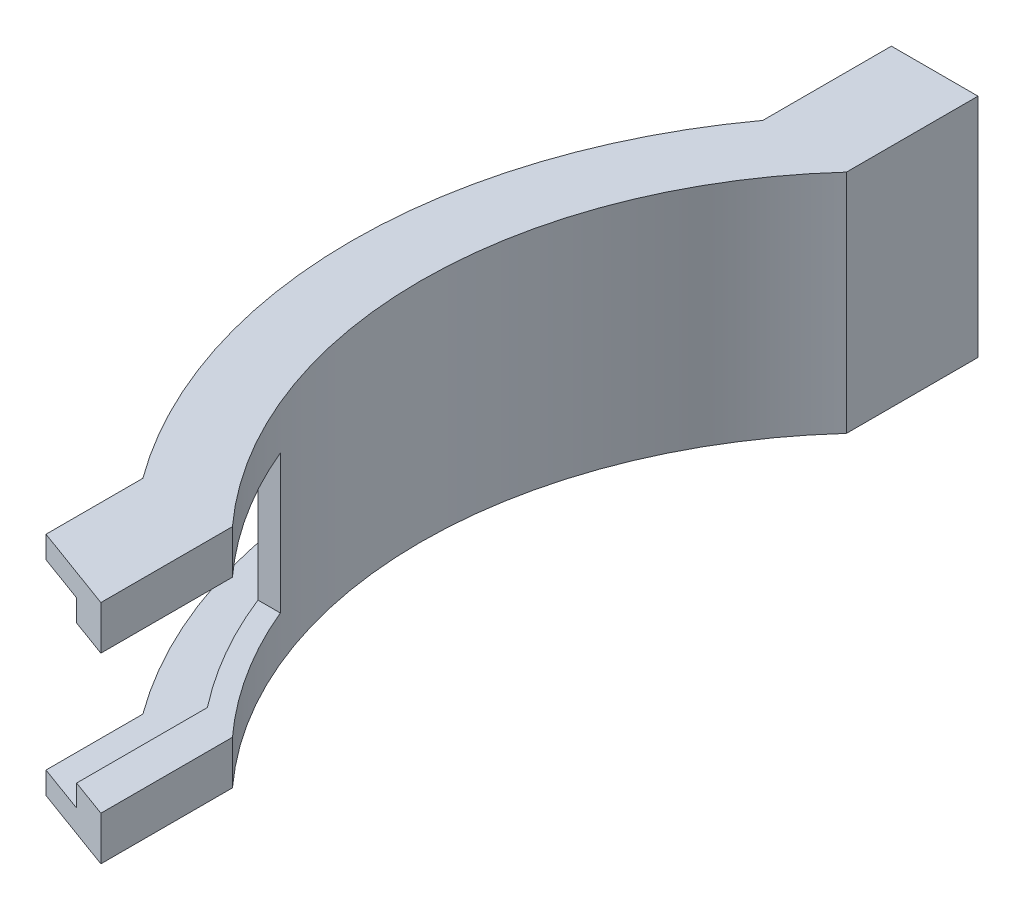
ISO-10303-21;
HEADER;
FILE_DESCRIPTION(('STEP AP214'),'2;1');
FILE_NAME('part.step','',(''),(''),'','','');
FILE_SCHEMA(('AUTOMOTIVE_DESIGN { 1 0 10303 214 1 1 1 1 }'));
ENDSEC;
DATA;
#1=APPLICATION_CONTEXT('core data for automotive mechanical design processes');
#2=APPLICATION_PROTOCOL_DEFINITION('international standard','automotive_design',2000,#1);
#3=PRODUCT_CONTEXT('',#1,'mechanical');
#4=PRODUCT('Part','Part','',(#3));
#5=PRODUCT_RELATED_PRODUCT_CATEGORY('part','',(#4));
#6=PRODUCT_DEFINITION_FORMATION('','',#4);
#7=PRODUCT_DEFINITION_CONTEXT('part definition',#1,'design');
#8=PRODUCT_DEFINITION('design','',#6,#7);
#9=PRODUCT_DEFINITION_SHAPE('','',#8);
#10=(LENGTH_UNIT() NAMED_UNIT(*) SI_UNIT(.MILLI.,.METRE.));
#11=(NAMED_UNIT(*) PLANE_ANGLE_UNIT() SI_UNIT($,.RADIAN.));
#12=(NAMED_UNIT(*) SI_UNIT($,.STERADIAN.) SOLID_ANGLE_UNIT());
#13=UNCERTAINTY_MEASURE_WITH_UNIT(LENGTH_MEASURE(1.E-05),#10,'distance_accuracy_value','');
#14=(GEOMETRIC_REPRESENTATION_CONTEXT(3) GLOBAL_UNCERTAINTY_ASSIGNED_CONTEXT((#13)) GLOBAL_UNIT_ASSIGNED_CONTEXT((#10,
#11,#12)) REPRESENTATION_CONTEXT('',''));
#15=CARTESIAN_POINT('',(0.,0.,0.));
#16=DIRECTION('',(0.,0.,1.));
#17=DIRECTION('',(1.,0.,0.));
#18=AXIS2_PLACEMENT_3D('',#15,#16,#17);
#19=CARTESIAN_POINT('',(20.6502,14.7955,10.4465519796));
#20=DIRECTION('',(1.,0.,0.));
#21=DIRECTION('',(0.,0.,-1.));
#22=AXIS2_PLACEMENT_3D('',#19,#20,#21);
#23=PLANE('',#22);
#24=DIRECTION('',(0.,0.,-1.));
#25=VECTOR('',#24,1.);
#26=CARTESIAN_POINT('',(20.6502,16.383,10.4465519796));
#27=LINE('',#26,#25);
#28=CARTESIAN_POINT('',(20.6502,16.383,3.17500000422744));
#29=VERTEX_POINT('',#28);
#30=CARTESIAN_POINT('',(20.6502,16.383,12.6999999966636));
#31=VERTEX_POINT('',#30);
#32=EDGE_CURVE('E318',#29,#31,#27,.F.);
#33=ORIENTED_EDGE('',*,*,#32,.T.);
#34=DIRECTION('',(0.,-1.,0.));
#35=VECTOR('',#34,1.);
#36=CARTESIAN_POINT('',(20.6502,14.7955,12.6999999966636));
#37=LINE('',#36,#35);
#38=CARTESIAN_POINT('',(20.6502,13.208,12.6999999966636));
#39=VERTEX_POINT('',#38);
#40=EDGE_CURVE('E26',#39,#31,#37,.F.);
#41=ORIENTED_EDGE('',*,*,#40,.F.);
#42=DIRECTION('',(0.,0.,-1.));
#43=VECTOR('',#42,1.);
#44=CARTESIAN_POINT('',(20.6502,13.208,10.4465519796));
#45=LINE('',#44,#43);
#46=CARTESIAN_POINT('',(20.6502,13.208,3.17500000422744));
#47=VERTEX_POINT('',#46);
#48=EDGE_CURVE('E334',#39,#47,#45,.T.);
#49=ORIENTED_EDGE('',*,*,#48,.T.);
#50=DIRECTION('',(0.,-1.,0.));
#51=VECTOR('',#50,1.);
#52=CARTESIAN_POINT('',(20.6502,16.383,3.17500000422744));
#53=LINE('',#52,#51);
#54=EDGE_CURVE('E397',#29,#47,#53,.T.);
#55=ORIENTED_EDGE('',*,*,#54,.F.);
#56=EDGE_LOOP('',(#33,#41,#49,#55));
#57=FACE_BOUND('',#56,.T.);
#58=ADVANCED_FACE('F18',(#57),#23,.T.);
#59=CARTESIAN_POINT('',(20.6502,1.5875,10.4465519796));
#60=DIRECTION('',(1.,0.,0.));
#61=DIRECTION('',(0.,0.,-1.));
#62=AXIS2_PLACEMENT_3D('',#59,#60,#61);
#63=PLANE('',#62);
#64=DIRECTION('',(0.,0.,-1.));
#65=VECTOR('',#64,1.);
#66=CARTESIAN_POINT('',(20.6502,3.175,10.4465519796));
#67=LINE('',#66,#65);
#68=CARTESIAN_POINT('',(20.6502,3.175,3.17500000422744));
#69=VERTEX_POINT('',#68);
#70=CARTESIAN_POINT('',(20.6502,3.175,12.6999999966636));
#71=VERTEX_POINT('',#70);
#72=EDGE_CURVE('E33',#69,#71,#67,.F.);
#73=ORIENTED_EDGE('',*,*,#72,.T.);
#74=DIRECTION('',(0.,-1.,0.));
#75=VECTOR('',#74,1.);
#76=CARTESIAN_POINT('',(20.6502,1.5875,12.6999999966636));
#77=LINE('',#76,#75);
#78=CARTESIAN_POINT('',(20.6502,0.,12.6999999966636));
#79=VERTEX_POINT('',#78);
#80=EDGE_CURVE('E10',#79,#71,#77,.F.);
#81=ORIENTED_EDGE('',*,*,#80,.F.);
#82=DIRECTION('',(0.,0.,-1.));
#83=VECTOR('',#82,1.);
#84=CARTESIAN_POINT('',(20.6502,0.,10.4465519796));
#85=LINE('',#84,#83);
#86=CARTESIAN_POINT('',(20.6502,0.,3.17500000422744));
#87=VERTEX_POINT('',#86);
#88=EDGE_CURVE('E314',#79,#87,#85,.T.);
#89=ORIENTED_EDGE('',*,*,#88,.T.);
#90=DIRECTION('',(0.,-1.,0.));
#91=VECTOR('',#90,1.);
#92=CARTESIAN_POINT('',(20.6502,1.58752750696706,3.17500000422744));
#93=LINE('',#92,#91);
#94=EDGE_CURVE('E230',#69,#87,#93,.T.);
#95=ORIENTED_EDGE('',*,*,#94,.F.);
#96=EDGE_LOOP('',(#73,#81,#89,#95));
#97=FACE_BOUND('',#96,.T.);
#98=ADVANCED_FACE('F20',(#97),#63,.T.);
#99=CARTESIAN_POINT('',(17.8802000056,16.383,-50.8));
#100=DIRECTION('',(-1.,0.,0.));
#101=DIRECTION('',(0.,0.,1.));
#102=AXIS2_PLACEMENT_3D('',#99,#100,#101);
#103=PLANE('',#102);
#104=DIRECTION('',(0.,0.,1.));
#105=VECTOR('',#104,1.);
#106=CARTESIAN_POINT('',(17.8802000056,14.783,-1.2944292247));
#107=LINE('',#106,#105);
#108=CARTESIAN_POINT('',(17.880200005598,14.783,-40.3172786173155));
#109=VERTEX_POINT('',#108);
#110=CARTESIAN_POINT('',(17.8802000056,14.783,-50.8));
#111=VERTEX_POINT('',#110);
#112=EDGE_CURVE('E321',#109,#111,#107,.F.);
#113=ORIENTED_EDGE('',*,*,#112,.T.);
#114=DIRECTION('',(0.,1.,0.));
#115=VECTOR('',#114,1.);
#116=CARTESIAN_POINT('',(17.8802000056,8.1915,-50.8));
#117=LINE('',#116,#115);
#118=CARTESIAN_POINT('',(17.8802000056,1.6,-50.8));
#119=VERTEX_POINT('',#118);
#120=EDGE_CURVE('E293',#111,#119,#117,.F.);
#121=ORIENTED_EDGE('',*,*,#120,.T.);
#122=DIRECTION('',(0.,0.,-1.));
#123=VECTOR('',#122,1.);
#124=CARTESIAN_POINT('',(17.8802000056,1.6,-1.2944292247));
#125=LINE('',#124,#123);
#126=CARTESIAN_POINT('',(17.880200005598,1.6,-40.3172786173155));
#127=VERTEX_POINT('',#126);
#128=EDGE_CURVE('E326',#119,#127,#125,.F.);
#129=ORIENTED_EDGE('',*,*,#128,.T.);
#130=DIRECTION('',(0.,1.,0.));
#131=VECTOR('',#130,1.);
#132=CARTESIAN_POINT('',(17.8802000055961,16.383,-40.317278617313));
#133=LINE('',#132,#131);
#134=EDGE_CURVE('E351',#109,#127,#133,.F.);
#135=ORIENTED_EDGE('',*,*,#134,.F.);
#136=EDGE_LOOP('',(#113,#121,#129,#135));
#137=FACE_BOUND('',#136,.T.);
#138=ADVANCED_FACE('F486',(#137),#103,.T.);
#139=CARTESIAN_POINT('',(-7.8581804101,14.783,-1.2944292247));
#140=DIRECTION('',(0.,1.,0.));
#141=DIRECTION('',(0.,0.,1.));
#142=AXIS2_PLACEMENT_3D('',#139,#140,#141);
#143=PLANE('',#142);
#144=CARTESIAN_POINT('',(45.0708833404,14.783,-19.05));
#145=DIRECTION('',(0.,1.,0.));
#146=DIRECTION('',(0.,0.,1.));
#147=AXIS2_PLACEMENT_3D('',#144,#145,#146);
#148=CIRCLE('',#147,34.52);
#149=CARTESIAN_POINT('',(17.8802000056,14.783,2.21727861731798));
#150=VERTEX_POINT('',#149);
#151=EDGE_CURVE('E325',#150,#109,#148,.F.);
#152=ORIENTED_EDGE('',*,*,#151,.F.);
#153=DIRECTION('',(0.,0.,1.));
#154=VECTOR('',#153,1.);
#155=CARTESIAN_POINT('',(17.8802000056,14.783,2.217278617312));
#156=LINE('',#155,#154);
#157=CARTESIAN_POINT('',(17.8802000056004,14.783,11.6849455696083));
#158=VERTEX_POINT('',#157);
#159=EDGE_CURVE('E285',#158,#150,#156,.F.);
#160=ORIENTED_EDGE('',*,*,#159,.F.);
#161=DIRECTION('',(0.93894337416401,0.,0.344071707807404));
#162=VECTOR('',#161,1.);
#163=CARTESIAN_POINT('',(12.7904342362,14.783,9.8198230832));
#164=LINE('',#163,#162);
#165=CARTESIAN_POINT('',(14.3802000056004,14.783,10.4023858216388));
#166=VERTEX_POINT('',#165);
#167=EDGE_CURVE('E264',#166,#158,#164,.T.);
#168=ORIENTED_EDGE('',*,*,#167,.F.);
#169=DIRECTION('',(0.,0.,1.));
#170=VECTOR('',#169,1.);
#171=CARTESIAN_POINT('',(14.3802000056,14.783,3.391086347205));
#172=LINE('',#171,#170);
#173=CARTESIAN_POINT('',(14.3802000056,14.783,3.39108634721005));
#174=VERTEX_POINT('',#173);
#175=EDGE_CURVE('E265',#174,#166,#172,.T.);
#176=ORIENTED_EDGE('',*,*,#175,.F.);
#177=CARTESIAN_POINT('',(45.0708833404,14.783,-19.05));
#178=DIRECTION('',(0.,1.,0.));
#179=DIRECTION('',(0.,0.,1.));
#180=AXIS2_PLACEMENT_3D('',#177,#178,#179);
#181=CIRCLE('',#180,38.02);
#182=CARTESIAN_POINT('',(14.3802000056,14.783,-41.491086347211));
#183=VERTEX_POINT('',#182);
#184=EDGE_CURVE('E272',#183,#174,#181,.T.);
#185=ORIENTED_EDGE('',*,*,#184,.F.);
#186=DIRECTION('',(0.,0.,1.));
#187=VECTOR('',#186,1.);
#188=CARTESIAN_POINT('',(14.3802000056,14.783,-50.8));
#189=LINE('',#188,#187);
#190=CARTESIAN_POINT('',(14.3802000056,14.783,-50.8));
#191=VERTEX_POINT('',#190);
#192=EDGE_CURVE('E251',#191,#183,#189,.T.);
#193=ORIENTED_EDGE('',*,*,#192,.F.);
#194=DIRECTION('',(1.,0.,0.));
#195=VECTOR('',#194,1.);
#196=CARTESIAN_POINT('',(16.2155730425,14.783,-50.8));
#197=LINE('',#196,#195);
#198=EDGE_CURVE('E256',#191,#111,#197,.T.);
#199=ORIENTED_EDGE('',*,*,#198,.T.);
#200=ORIENTED_EDGE('',*,*,#112,.F.);
#201=EDGE_LOOP('',(#152,#160,#168,#176,#185,#193,#199,#200));
#202=FACE_BOUND('',#201,.T.);
#203=ADVANCED_FACE('F490',(#202),#143,.F.);
#204=CARTESIAN_POINT('',(-7.8581804101,1.6,-1.2944292247));
#205=DIRECTION('',(0.,-1.,0.));
#206=DIRECTION('',(0.,0.,-1.));
#207=AXIS2_PLACEMENT_3D('',#204,#205,#206);
#208=PLANE('',#207);
#209=CARTESIAN_POINT('',(45.0708833404,1.6,-19.05));
#210=DIRECTION('',(0.,1.,0.));
#211=DIRECTION('',(0.,0.,1.));
#212=AXIS2_PLACEMENT_3D('',#209,#210,#211);
#213=CIRCLE('',#212,34.52);
#214=CARTESIAN_POINT('',(17.8802000055993,1.6,2.21727861731704));
#215=VERTEX_POINT('',#214);
#216=EDGE_CURVE('E289',#127,#215,#213,.T.);
#217=ORIENTED_EDGE('',*,*,#216,.F.);
#218=ORIENTED_EDGE('',*,*,#128,.F.);
#219=DIRECTION('',(1.,0.,0.));
#220=VECTOR('',#219,1.);
#221=CARTESIAN_POINT('',(16.2155730425,1.6,-50.8));
#222=LINE('',#221,#220);
#223=CARTESIAN_POINT('',(14.3802000056,1.6,-50.8));
#224=VERTEX_POINT('',#223);
#225=EDGE_CURVE('E257',#119,#224,#222,.F.);
#226=ORIENTED_EDGE('',*,*,#225,.T.);
#227=DIRECTION('',(0.,0.,1.));
#228=VECTOR('',#227,1.);
#229=CARTESIAN_POINT('',(14.3802000056,1.6,-41.49108634721));
#230=LINE('',#229,#228);
#231=CARTESIAN_POINT('',(14.3802000055995,1.6,-41.4910863472114));
#232=VERTEX_POINT('',#231);
#233=EDGE_CURVE('E173',#232,#224,#230,.F.);
#234=ORIENTED_EDGE('',*,*,#233,.F.);
#235=CARTESIAN_POINT('',(45.0708833404,1.6,-19.05));
#236=DIRECTION('',(0.,-1.,0.));
#237=DIRECTION('',(0.,0.,-1.));
#238=AXIS2_PLACEMENT_3D('',#235,#236,#237);
#239=CIRCLE('',#238,38.02);
#240=CARTESIAN_POINT('',(14.380200005599,1.6,3.39108634721078));
#241=VERTEX_POINT('',#240);
#242=EDGE_CURVE('E231',#241,#232,#239,.T.);
#243=ORIENTED_EDGE('',*,*,#242,.F.);
#244=DIRECTION('',(0.,0.,1.));
#245=VECTOR('',#244,1.);
#246=CARTESIAN_POINT('',(14.3802000056,1.6,10.40238582164));
#247=LINE('',#246,#245);
#248=CARTESIAN_POINT('',(14.3802000056004,1.6,10.4023858216382));
#249=VERTEX_POINT('',#248);
#250=EDGE_CURVE('E247',#249,#241,#247,.F.);
#251=ORIENTED_EDGE('',*,*,#250,.F.);
#252=DIRECTION('',(0.93894337416401,0.,0.344071707807404));
#253=VECTOR('',#252,1.);
#254=CARTESIAN_POINT('',(12.7904342362,1.6,9.8198230832));
#255=LINE('',#254,#253);
#256=CARTESIAN_POINT('',(17.8802000056004,1.6,11.6849455696083));
#257=VERTEX_POINT('',#256);
#258=EDGE_CURVE('E241',#257,#249,#255,.F.);
#259=ORIENTED_EDGE('',*,*,#258,.F.);
#260=DIRECTION('',(0.,0.,1.));
#261=VECTOR('',#260,1.);
#262=CARTESIAN_POINT('',(17.8802000056,1.6,2.217278617312));
#263=LINE('',#262,#261);
#264=EDGE_CURVE('E322',#215,#257,#263,.T.);
#265=ORIENTED_EDGE('',*,*,#264,.F.);
#266=EDGE_LOOP('',(#217,#218,#226,#234,#243,#251,#259,#265));
#267=FACE_BOUND('',#266,.T.);
#268=ADVANCED_FACE('F527',(#267),#208,.F.);
#269=CARTESIAN_POINT('',(17.8802000056,16.383,2.217278617312));
#270=DIRECTION('',(-1.,0.,0.));
#271=DIRECTION('',(0.,0.,1.));
#272=AXIS2_PLACEMENT_3D('',#269,#270,#271);
#273=PLANE('',#272);
#274=DIRECTION('',(0.,1.,0.));
#275=VECTOR('',#274,1.);
#276=CARTESIAN_POINT('',(17.8802000056006,1.5875,11.6849455696083));
#277=LINE('',#276,#275);
#278=CARTESIAN_POINT('',(17.8802000056002,3.175,11.6849455696094));
#279=VERTEX_POINT('',#278);
#280=EDGE_CURVE('E240',#279,#257,#277,.F.);
#281=ORIENTED_EDGE('',*,*,#280,.F.);
#282=DIRECTION('',(0.,0.,1.));
#283=VECTOR('',#282,1.);
#284=CARTESIAN_POINT('',(17.8802000056,3.175,12.50962016732));
#285=LINE('',#284,#283);
#286=CARTESIAN_POINT('',(17.8802000055993,3.175,2.21727861731704));
#287=VERTEX_POINT('',#286);
#288=EDGE_CURVE('E412',#287,#279,#285,.T.);
#289=ORIENTED_EDGE('',*,*,#288,.F.);
#290=DIRECTION('',(0.,1.,0.));
#291=VECTOR('',#290,1.);
#292=CARTESIAN_POINT('',(17.8802000055985,16.383,2.21727861731613));
#293=LINE('',#292,#291);
#294=EDGE_CURVE('E286',#215,#287,#293,.T.);
#295=ORIENTED_EDGE('',*,*,#294,.F.);
#296=ORIENTED_EDGE('',*,*,#264,.T.);
#297=EDGE_LOOP('',(#281,#289,#295,#296));
#298=FACE_BOUND('',#297,.T.);
#299=ADVANCED_FACE('F703',(#298),#273,.T.);
#300=CARTESIAN_POINT('',(45.0708833404,16.383,-19.05));
#301=DIRECTION('',(0.,1.,0.));
#302=DIRECTION('',(0.,0.,1.));
#303=AXIS2_PLACEMENT_3D('',#300,#301,#302);
#304=CYLINDRICAL_SURFACE('',#303,34.52);
#305=ORIENTED_EDGE('',*,*,#294,.T.);
#306=CARTESIAN_POINT('',(45.0708833404,3.175,-19.05));
#307=DIRECTION('',(0.,1.,0.));
#308=DIRECTION('',(0.,0.,1.));
#309=AXIS2_PLACEMENT_3D('',#306,#307,#308);
#310=CIRCLE('',#309,34.52);
#311=CARTESIAN_POINT('',(12.9719674705335,3.175,-6.35));
#312=VERTEX_POINT('',#311);
#313=EDGE_CURVE('E226',#312,#287,#310,.T.);
#314=ORIENTED_EDGE('',*,*,#313,.F.);
#315=DIRECTION('',(0.,1.,0.));
#316=VECTOR('',#315,1.);
#317=CARTESIAN_POINT('',(12.97196747021,8.1915,-6.35));
#318=LINE('',#317,#316);
#319=CARTESIAN_POINT('',(12.9719674702138,13.208,-6.350000000808));
#320=VERTEX_POINT('',#319);
#321=EDGE_CURVE('E225',#320,#312,#318,.F.);
#322=ORIENTED_EDGE('',*,*,#321,.F.);
#323=CARTESIAN_POINT('',(45.0708833404,13.208,-19.05));
#324=DIRECTION('',(0.,1.,0.));
#325=DIRECTION('',(0.,0.,1.));
#326=AXIS2_PLACEMENT_3D('',#323,#324,#325);
#327=CIRCLE('',#326,34.52);
#328=CARTESIAN_POINT('',(17.8802000056,13.208,2.21727861731798));
#329=VERTEX_POINT('',#328);
#330=EDGE_CURVE('E276',#320,#329,#327,.T.);
#331=ORIENTED_EDGE('',*,*,#330,.T.);
#332=DIRECTION('',(0.,1.,0.));
#333=VECTOR('',#332,1.);
#334=CARTESIAN_POINT('',(17.8802000056,16.383,2.217278617318));
#335=LINE('',#334,#333);
#336=EDGE_CURVE('E282',#150,#329,#335,.F.);
#337=ORIENTED_EDGE('',*,*,#336,.F.);
#338=ORIENTED_EDGE('',*,*,#151,.T.);
#339=ORIENTED_EDGE('',*,*,#134,.T.);
#340=ORIENTED_EDGE('',*,*,#216,.T.);
#341=EDGE_LOOP('',(#305,#314,#322,#331,#337,#338,#339,#340));
#342=FACE_BOUND('',#341,.T.);
#343=ADVANCED_FACE('F532',(#342),#304,.T.);
#344=CARTESIAN_POINT('',(17.8802000056,16.383,2.217278617312));
#345=DIRECTION('',(-1.,0.,0.));
#346=DIRECTION('',(0.,0.,1.));
#347=AXIS2_PLACEMENT_3D('',#344,#345,#346);
#348=PLANE('',#347);
#349=ORIENTED_EDGE('',*,*,#336,.T.);
#350=DIRECTION('',(0.,0.,1.));
#351=VECTOR('',#350,1.);
#352=CARTESIAN_POINT('',(17.8802000056,13.208,12.5096012122));
#353=LINE('',#352,#351);
#354=CARTESIAN_POINT('',(17.8802000056002,13.208,11.6849455696094));
#355=VERTEX_POINT('',#354);
#356=EDGE_CURVE('E378',#329,#355,#353,.T.);
#357=ORIENTED_EDGE('',*,*,#356,.T.);
#358=DIRECTION('',(0.,1.,0.));
#359=VECTOR('',#358,1.);
#360=CARTESIAN_POINT('',(17.8802000056006,14.7955,11.6849455696083));
#361=LINE('',#360,#359);
#362=EDGE_CURVE('E277',#158,#355,#361,.F.);
#363=ORIENTED_EDGE('',*,*,#362,.F.);
#364=ORIENTED_EDGE('',*,*,#159,.T.);
#365=EDGE_LOOP('',(#349,#357,#363,#364));
#366=FACE_BOUND('',#365,.T.);
#367=ADVANCED_FACE('F506',(#366),#348,.T.);
#368=CARTESIAN_POINT('',(45.0708833404,16.383,-19.05));
#369=DIRECTION('',(0.,1.,0.));
#370=DIRECTION('',(0.,0.,1.));
#371=AXIS2_PLACEMENT_3D('',#368,#369,#370);
#372=CYLINDRICAL_SURFACE('',#371,38.02);
#373=DIRECTION('',(0.,1.,0.));
#374=VECTOR('',#373,1.);
#375=CARTESIAN_POINT('',(14.3802000056,16.383,3.391086347208));
#376=LINE('',#375,#374);
#377=CARTESIAN_POINT('',(14.3802000056,16.383,3.39108634721005));
#378=VERTEX_POINT('',#377);
#379=EDGE_CURVE('E268',#378,#174,#376,.F.);
#380=ORIENTED_EDGE('',*,*,#379,.F.);
#381=CARTESIAN_POINT('',(45.0708833404,16.383,-19.05));
#382=DIRECTION('',(0.,1.,0.));
#383=DIRECTION('',(0.,0.,1.));
#384=AXIS2_PLACEMENT_3D('',#381,#382,#383);
#385=CIRCLE('',#384,38.02);
#386=CARTESIAN_POINT('',(14.3802000056,16.383,-41.491086347211));
#387=VERTEX_POINT('',#386);
#388=EDGE_CURVE('E370',#387,#378,#385,.T.);
#389=ORIENTED_EDGE('',*,*,#388,.F.);
#390=DIRECTION('',(0.,1.,0.));
#391=VECTOR('',#390,1.);
#392=CARTESIAN_POINT('',(14.3802000056,16.383,-41.49108634721));
#393=LINE('',#392,#391);
#394=EDGE_CURVE('E248',#183,#387,#393,.T.);
#395=ORIENTED_EDGE('',*,*,#394,.F.);
#396=ORIENTED_EDGE('',*,*,#184,.T.);
#397=EDGE_LOOP('',(#380,#389,#395,#396));
#398=FACE_BOUND('',#397,.T.);
#399=ADVANCED_FACE('F498',(#398),#372,.T.);
#400=CARTESIAN_POINT('',(14.3802000056,16.383,3.391086347205));
#401=DIRECTION('',(-1.,0.,0.));
#402=DIRECTION('',(0.,0.,1.));
#403=AXIS2_PLACEMENT_3D('',#400,#401,#402);
#404=PLANE('',#403);
#405=DIRECTION('',(0.,1.,0.));
#406=VECTOR('',#405,1.);
#407=CARTESIAN_POINT('',(14.3802000056006,14.7955,10.4023858216382));
#408=LINE('',#407,#406);
#409=CARTESIAN_POINT('',(14.3802000056002,16.383,10.4023858216394));
#410=VERTEX_POINT('',#409);
#411=EDGE_CURVE('E260',#410,#166,#408,.F.);
#412=ORIENTED_EDGE('',*,*,#411,.F.);
#413=DIRECTION('',(0.,0.,1.));
#414=VECTOR('',#413,1.);
#415=CARTESIAN_POINT('',(14.3802000056,16.383,-9.715398802241));
#416=LINE('',#415,#414);
#417=EDGE_CURVE('E373',#378,#410,#416,.T.);
#418=ORIENTED_EDGE('',*,*,#417,.F.);
#419=ORIENTED_EDGE('',*,*,#379,.T.);
#420=ORIENTED_EDGE('',*,*,#175,.T.);
#421=EDGE_LOOP('',(#412,#418,#419,#420));
#422=FACE_BOUND('',#421,.T.);
#423=ADVANCED_FACE('F500',(#422),#404,.T.);
#424=CARTESIAN_POINT('',(12.7904342362,14.7955,9.8198230832));
#425=DIRECTION('',(-0.344071707807404,0.,0.93894337416401));
#426=DIRECTION('',(0.93894337416401,0.,0.344071707807404));
#427=AXIS2_PLACEMENT_3D('',#424,#425,#426);
#428=PLANE('',#427);
#429=ORIENTED_EDGE('',*,*,#167,.T.);
#430=ORIENTED_EDGE('',*,*,#362,.T.);
#431=DIRECTION('',(0.938943375243112,0.,0.344071704862623));
#432=VECTOR('',#431,1.);
#433=CARTESIAN_POINT('',(17.8802000056,13.208,11.68494556961));
#434=LINE('',#433,#432);
#435=EDGE_CURVE('E421',#355,#39,#434,.T.);
#436=ORIENTED_EDGE('',*,*,#435,.T.);
#437=ORIENTED_EDGE('',*,*,#40,.T.);
#438=DIRECTION('',(0.938943374346476,0.,0.344071707309469));
#439=VECTOR('',#438,1.);
#440=CARTESIAN_POINT('',(14.3802000056,16.383,10.40238582164));
#441=LINE('',#440,#439);
#442=EDGE_CURVE('E419',#410,#31,#441,.T.);
#443=ORIENTED_EDGE('',*,*,#442,.F.);
#444=ORIENTED_EDGE('',*,*,#411,.T.);
#445=EDGE_LOOP('',(#429,#430,#436,#437,#443,#444));
#446=FACE_BOUND('',#445,.T.);
#447=ADVANCED_FACE('F417',(#446),#428,.T.);
#448=CARTESIAN_POINT('',(14.3802000056,16.383,-50.8));
#449=DIRECTION('',(-1.,0.,0.));
#450=DIRECTION('',(0.,0.,1.));
#451=AXIS2_PLACEMENT_3D('',#448,#449,#450);
#452=PLANE('',#451);
#453=DIRECTION('',(0.,0.,1.));
#454=VECTOR('',#453,1.);
#455=CARTESIAN_POINT('',(14.3802000056,16.383,-9.715398802241));
#456=LINE('',#455,#454);
#457=CARTESIAN_POINT('',(14.3802000056,16.383,-50.8));
#458=VERTEX_POINT('',#457);
#459=EDGE_CURVE('E213',#458,#387,#456,.T.);
#460=ORIENTED_EDGE('',*,*,#459,.F.);
#461=DIRECTION('',(0.,1.,0.));
#462=VECTOR('',#461,1.);
#463=CARTESIAN_POINT('',(14.3802000056,8.1915,-50.8));
#464=LINE('',#463,#462);
#465=EDGE_CURVE('E252',#458,#191,#464,.F.);
#466=ORIENTED_EDGE('',*,*,#465,.T.);
#467=ORIENTED_EDGE('',*,*,#192,.T.);
#468=ORIENTED_EDGE('',*,*,#394,.T.);
#469=EDGE_LOOP('',(#460,#466,#467,#468));
#470=FACE_BOUND('',#469,.T.);
#471=ADVANCED_FACE('F493',(#470),#452,.T.);
#472=CARTESIAN_POINT('',(20.6502,8.1915,-41.8355370806));
#473=DIRECTION('',(1.,0.,0.));
#474=DIRECTION('',(0.,0.,-1.));
#475=AXIS2_PLACEMENT_3D('',#472,#473,#474);
#476=PLANE('',#475);
#477=DIRECTION('',(0.,0.,1.));
#478=VECTOR('',#477,1.);
#479=CARTESIAN_POINT('',(20.6502,16.383,-9.715398802241));
#480=LINE('',#479,#478);
#481=CARTESIAN_POINT('',(20.6502,16.383,-41.2750000042275));
#482=VERTEX_POINT('',#481);
#483=CARTESIAN_POINT('',(20.6502,16.383,-50.8));
#484=VERTEX_POINT('',#483);
#485=EDGE_CURVE('E431',#482,#484,#480,.F.);
#486=ORIENTED_EDGE('',*,*,#485,.F.);
#487=DIRECTION('',(0.,-1.,0.));
#488=VECTOR('',#487,1.);
#489=CARTESIAN_POINT('',(20.6502,16.383,-41.2750000042275));
#490=LINE('',#489,#488);
#491=CARTESIAN_POINT('',(20.6502,0.,-41.2750000042275));
#492=VERTEX_POINT('',#491);
#493=EDGE_CURVE('E357',#492,#482,#490,.F.);
#494=ORIENTED_EDGE('',*,*,#493,.F.);
#495=DIRECTION('',(0.,0.,-1.));
#496=VECTOR('',#495,1.);
#497=CARTESIAN_POINT('',(20.6502,0.,-41.8355370806));
#498=LINE('',#497,#496);
#499=CARTESIAN_POINT('',(20.6502,0.,-50.8));
#500=VERTEX_POINT('',#499);
#501=EDGE_CURVE('E244',#492,#500,#498,.T.);
#502=ORIENTED_EDGE('',*,*,#501,.T.);
#503=DIRECTION('',(0.,1.,0.));
#504=VECTOR('',#503,1.);
#505=CARTESIAN_POINT('',(20.6502,8.1915,-50.8));
#506=LINE('',#505,#504);
#507=EDGE_CURVE('E194',#500,#484,#506,.T.);
#508=ORIENTED_EDGE('',*,*,#507,.T.);
#509=EDGE_LOOP('',(#486,#494,#502,#508));
#510=FACE_BOUND('',#509,.T.);
#511=ADVANCED_FACE('F517',(#510),#476,.T.);
#512=CARTESIAN_POINT('',(14.3802000056,0.,10.40238582164));
#513=DIRECTION('',(-1.,0.,0.));
#514=DIRECTION('',(0.,0.,1.));
#515=AXIS2_PLACEMENT_3D('',#512,#513,#514);
#516=PLANE('',#515);
#517=DIRECTION('',(0.,-1.,0.));
#518=VECTOR('',#517,1.);
#519=CARTESIAN_POINT('',(14.3802000055981,0.,3.39108634720946));
#520=LINE('',#519,#518);
#521=CARTESIAN_POINT('',(14.380200005599,0.,3.39108634721078));
#522=VERTEX_POINT('',#521);
#523=EDGE_CURVE('E179',#522,#241,#520,.F.);
#524=ORIENTED_EDGE('',*,*,#523,.F.);
#525=DIRECTION('',(0.,0.,1.));
#526=VECTOR('',#525,1.);
#527=CARTESIAN_POINT('',(14.3802000056,0.,-9.715379847109));
#528=LINE('',#527,#526);
#529=CARTESIAN_POINT('',(14.3802000056002,0.,10.4023858216394));
#530=VERTEX_POINT('',#529);
#531=EDGE_CURVE('E201',#522,#530,#528,.T.);
#532=ORIENTED_EDGE('',*,*,#531,.T.);
#533=DIRECTION('',(0.,1.,0.));
#534=VECTOR('',#533,1.);
#535=CARTESIAN_POINT('',(14.3802000056006,1.5875,10.4023858216382));
#536=LINE('',#535,#534);
#537=EDGE_CURVE('E237',#249,#530,#536,.F.);
#538=ORIENTED_EDGE('',*,*,#537,.F.);
#539=ORIENTED_EDGE('',*,*,#250,.T.);
#540=EDGE_LOOP('',(#524,#532,#538,#539));
#541=FACE_BOUND('',#540,.T.);
#542=ADVANCED_FACE('F522',(#541),#516,.T.);
#543=CARTESIAN_POINT('',(12.7904342362,1.5875,9.8198230832));
#544=DIRECTION('',(-0.344071707807404,0.,0.93894337416401));
#545=DIRECTION('',(0.93894337416401,0.,0.344071707807404));
#546=AXIS2_PLACEMENT_3D('',#543,#544,#545);
#547=PLANE('',#546);
#548=DIRECTION('',(0.9389433752415,0.,0.344071704867024));
#549=VECTOR('',#548,1.);
#550=CARTESIAN_POINT('',(17.8802000056,3.175,11.68494556961));
#551=LINE('',#550,#549);
#552=EDGE_CURVE('E382',#279,#71,#551,.T.);
#553=ORIENTED_EDGE('',*,*,#552,.F.);
#554=ORIENTED_EDGE('',*,*,#280,.T.);
#555=ORIENTED_EDGE('',*,*,#258,.T.);
#556=ORIENTED_EDGE('',*,*,#537,.T.);
#557=DIRECTION('',(0.938943374346371,0.,0.344071707309758));
#558=VECTOR('',#557,1.);
#559=CARTESIAN_POINT('',(14.3802000056,0.,10.40238582164));
#560=LINE('',#559,#558);
#561=EDGE_CURVE('E40',#530,#79,#560,.T.);
#562=ORIENTED_EDGE('',*,*,#561,.T.);
#563=ORIENTED_EDGE('',*,*,#80,.T.);
#564=EDGE_LOOP('',(#553,#554,#555,#556,#562,#563));
#565=FACE_BOUND('',#564,.T.);
#566=ADVANCED_FACE('F542',(#565),#547,.T.);
#567=CARTESIAN_POINT('',(16.2155730425,8.1915,-50.8));
#568=DIRECTION('',(0.,0.,1.));
#569=DIRECTION('',(1.,0.,0.));
#570=AXIS2_PLACEMENT_3D('',#567,#568,#569);
#571=PLANE('',#570);
#572=ORIENTED_EDGE('',*,*,#465,.F.);
#573=DIRECTION('',(1.,0.,0.));
#574=VECTOR('',#573,1.);
#575=CARTESIAN_POINT('',(3.204529289451,16.383,-50.8));
#576=LINE('',#575,#574);
#577=EDGE_CURVE('E437',#484,#458,#576,.F.);
#578=ORIENTED_EDGE('',*,*,#577,.F.);
#579=ORIENTED_EDGE('',*,*,#507,.F.);
#580=DIRECTION('',(1.,0.,0.));
#581=VECTOR('',#580,1.);
#582=CARTESIAN_POINT('',(3.204524273943,0.,-50.8));
#583=LINE('',#582,#581);
#584=CARTESIAN_POINT('',(14.3802000056,0.,-50.8));
#585=VERTEX_POINT('',#584);
#586=EDGE_CURVE('E185',#500,#585,#583,.F.);
#587=ORIENTED_EDGE('',*,*,#586,.T.);
#588=DIRECTION('',(0.,1.,0.));
#589=VECTOR('',#588,1.);
#590=CARTESIAN_POINT('',(14.3802000056,0.,-50.8));
#591=LINE('',#590,#589);
#592=EDGE_CURVE('E168',#224,#585,#591,.F.);
#593=ORIENTED_EDGE('',*,*,#592,.F.);
#594=ORIENTED_EDGE('',*,*,#225,.F.);
#595=ORIENTED_EDGE('',*,*,#120,.F.);
#596=ORIENTED_EDGE('',*,*,#198,.F.);
#597=EDGE_LOOP('',(#572,#578,#579,#587,#593,#594,#595,#596));
#598=FACE_BOUND('',#597,.T.);
#599=ADVANCED_FACE('F191',(#598),#571,.F.);
#600=CARTESIAN_POINT('',(14.3802000056,0.,-41.49108634721));
#601=DIRECTION('',(-1.,0.,0.));
#602=DIRECTION('',(0.,0.,1.));
#603=AXIS2_PLACEMENT_3D('',#600,#601,#602);
#604=PLANE('',#603);
#605=ORIENTED_EDGE('',*,*,#592,.T.);
#606=DIRECTION('',(0.,0.,1.));
#607=VECTOR('',#606,1.);
#608=CARTESIAN_POINT('',(14.3802000056,0.,-9.715379847109));
#609=LINE('',#608,#607);
#610=CARTESIAN_POINT('',(14.3802000055995,0.,-41.4910863472114));
#611=VERTEX_POINT('',#610);
#612=EDGE_CURVE('E172',#585,#611,#609,.T.);
#613=ORIENTED_EDGE('',*,*,#612,.T.);
#614=DIRECTION('',(0.,-1.,0.));
#615=VECTOR('',#614,1.);
#616=CARTESIAN_POINT('',(14.380200005599,0.,-41.4910863472107));
#617=LINE('',#616,#615);
#618=EDGE_CURVE('E227',#232,#611,#617,.T.);
#619=ORIENTED_EDGE('',*,*,#618,.F.);
#620=ORIENTED_EDGE('',*,*,#233,.T.);
#621=EDGE_LOOP('',(#605,#613,#619,#620));
#622=FACE_BOUND('',#621,.T.);
#623=ADVANCED_FACE('F170',(#622),#604,.T.);
#624=CARTESIAN_POINT('',(45.0708833404,0.,-19.05));
#625=DIRECTION('',(0.,-1.,0.));
#626=DIRECTION('',(0.,0.,-1.));
#627=AXIS2_PLACEMENT_3D('',#624,#625,#626);
#628=CYLINDRICAL_SURFACE('',#627,38.02);
#629=ORIENTED_EDGE('',*,*,#618,.T.);
#630=CARTESIAN_POINT('',(45.0708833404,0.,-19.05));
#631=DIRECTION('',(0.,-1.,0.));
#632=DIRECTION('',(0.,0.,-1.));
#633=AXIS2_PLACEMENT_3D('',#630,#631,#632);
#634=CIRCLE('',#633,38.02);
#635=EDGE_CURVE('E188',#611,#522,#634,.F.);
#636=ORIENTED_EDGE('',*,*,#635,.T.);
#637=ORIENTED_EDGE('',*,*,#523,.T.);
#638=ORIENTED_EDGE('',*,*,#242,.T.);
#639=EDGE_LOOP('',(#629,#636,#637,#638));
#640=FACE_BOUND('',#639,.T.);
#641=ADVANCED_FACE('F524',(#640),#628,.T.);
#642=CARTESIAN_POINT('',(3.204524273287,3.175,12.50962016732));
#643=DIRECTION('',(0.,1.,0.));
#644=DIRECTION('',(0.,0.,1.));
#645=AXIS2_PLACEMENT_3D('',#642,#643,#644);
#646=PLANE('',#645);
#647=ORIENTED_EDGE('',*,*,#72,.F.);
#648=CARTESIAN_POINT('',(45.0708833404,3.175,-19.05));
#649=DIRECTION('',(0.,-1.,0.));
#650=DIRECTION('',(0.,0.,-1.));
#651=AXIS2_PLACEMENT_3D('',#648,#649,#650);
#652=CIRCLE('',#651,33.02);
#653=CARTESIAN_POINT('',(14.5908833399927,3.175,-6.35000000097754));
#654=VERTEX_POINT('',#653);
#655=EDGE_CURVE('E221',#69,#654,#652,.T.);
#656=ORIENTED_EDGE('',*,*,#655,.T.);
#657=DIRECTION('',(1.,0.,0.));
#658=VECTOR('',#657,1.);
#659=CARTESIAN_POINT('',(6.7759564506,3.175,-6.35));
#660=LINE('',#659,#658);
#661=EDGE_CURVE('E222',#312,#654,#660,.T.);
#662=ORIENTED_EDGE('',*,*,#661,.F.);
#663=ORIENTED_EDGE('',*,*,#313,.T.);
#664=ORIENTED_EDGE('',*,*,#288,.T.);
#665=ORIENTED_EDGE('',*,*,#552,.T.);
#666=EDGE_LOOP('',(#647,#656,#662,#663,#664,#665));
#667=FACE_BOUND('',#666,.T.);
#668=ADVANCED_FACE('F538',(#667),#646,.T.);
#669=CARTESIAN_POINT('',(6.7759564506,8.1915,-6.35));
#670=DIRECTION('',(0.,0.,1.));
#671=DIRECTION('',(1.,0.,0.));
#672=AXIS2_PLACEMENT_3D('',#669,#670,#671);
#673=PLANE('',#672);
#674=DIRECTION('',(1.,0.,0.));
#675=VECTOR('',#674,1.);
#676=CARTESIAN_POINT('',(3.204529288512,13.208,-6.350000001616));
#677=LINE('',#676,#675);
#678=CARTESIAN_POINT('',(14.590883339656,13.208,-6.35000000178554));
#679=VERTEX_POINT('',#678);
#680=EDGE_CURVE('E374',#679,#320,#677,.F.);
#681=ORIENTED_EDGE('',*,*,#680,.T.);
#682=ORIENTED_EDGE('',*,*,#321,.T.);
#683=ORIENTED_EDGE('',*,*,#661,.T.);
#684=DIRECTION('',(0.,-1.,0.));
#685=VECTOR('',#684,1.);
#686=CARTESIAN_POINT('',(14.5908833395854,16.383,-6.35000000195508));
#687=LINE('',#686,#685);
#688=EDGE_CURVE('E216',#654,#679,#687,.F.);
#689=ORIENTED_EDGE('',*,*,#688,.T.);
#690=EDGE_LOOP('',(#681,#682,#683,#689));
#691=FACE_BOUND('',#690,.T.);
#692=ADVANCED_FACE('F536',(#691),#673,.T.);
#693=CARTESIAN_POINT('',(3.204529288512,13.208,12.5096012122));
#694=DIRECTION('',(0.,1.,0.));
#695=DIRECTION('',(0.,0.,1.));
#696=AXIS2_PLACEMENT_3D('',#693,#694,#695);
#697=PLANE('',#696);
#698=CARTESIAN_POINT('',(45.0708833404,13.208,-19.05));
#699=DIRECTION('',(0.,-1.,0.));
#700=DIRECTION('',(0.,0.,-1.));
#701=AXIS2_PLACEMENT_3D('',#698,#699,#700);
#702=CIRCLE('',#701,33.02);
#703=EDGE_CURVE('E220',#679,#47,#702,.F.);
#704=ORIENTED_EDGE('',*,*,#703,.T.);
#705=ORIENTED_EDGE('',*,*,#48,.F.);
#706=ORIENTED_EDGE('',*,*,#435,.F.);
#707=ORIENTED_EDGE('',*,*,#356,.F.);
#708=ORIENTED_EDGE('',*,*,#330,.F.);
#709=ORIENTED_EDGE('',*,*,#680,.F.);
#710=EDGE_LOOP('',(#704,#705,#706,#707,#708,#709));
#711=FACE_BOUND('',#710,.T.);
#712=ADVANCED_FACE('F509',(#711),#697,.F.);
#713=CARTESIAN_POINT('',(3.204529289451,16.383,-9.715398802241));
#714=DIRECTION('',(0.,1.,0.));
#715=DIRECTION('',(0.,0.,1.));
#716=AXIS2_PLACEMENT_3D('',#713,#714,#715);
#717=PLANE('',#716);
#718=ORIENTED_EDGE('',*,*,#32,.F.);
#719=CARTESIAN_POINT('',(45.0708833404,16.383,-19.05));
#720=DIRECTION('',(0.,-1.,0.));
#721=DIRECTION('',(0.,0.,-1.));
#722=AXIS2_PLACEMENT_3D('',#719,#720,#721);
#723=CIRCLE('',#722,33.02);
#724=EDGE_CURVE('E358',#29,#482,#723,.T.);
#725=ORIENTED_EDGE('',*,*,#724,.T.);
#726=ORIENTED_EDGE('',*,*,#485,.T.);
#727=ORIENTED_EDGE('',*,*,#577,.T.);
#728=ORIENTED_EDGE('',*,*,#459,.T.);
#729=ORIENTED_EDGE('',*,*,#388,.T.);
#730=ORIENTED_EDGE('',*,*,#417,.T.);
#731=ORIENTED_EDGE('',*,*,#442,.T.);
#732=EDGE_LOOP('',(#718,#725,#726,#727,#728,#729,#730,#731));
#733=FACE_BOUND('',#732,.T.);
#734=ADVANCED_FACE('F427',(#733),#717,.T.);
#735=CARTESIAN_POINT('',(3.204524273943,0.,-9.715379847109));
#736=DIRECTION('',(0.,1.,0.));
#737=DIRECTION('',(0.,0.,1.));
#738=AXIS2_PLACEMENT_3D('',#735,#736,#737);
#739=PLANE('',#738);
#740=CARTESIAN_POINT('',(45.0708833404,0.,-19.05));
#741=DIRECTION('',(0.,-1.,0.));
#742=DIRECTION('',(0.,0.,-1.));
#743=AXIS2_PLACEMENT_3D('',#740,#741,#742);
#744=CIRCLE('',#743,33.02);
#745=EDGE_CURVE('E354',#492,#87,#744,.F.);
#746=ORIENTED_EDGE('',*,*,#745,.T.);
#747=ORIENTED_EDGE('',*,*,#88,.F.);
#748=ORIENTED_EDGE('',*,*,#561,.F.);
#749=ORIENTED_EDGE('',*,*,#531,.F.);
#750=ORIENTED_EDGE('',*,*,#635,.F.);
#751=ORIENTED_EDGE('',*,*,#612,.F.);
#752=ORIENTED_EDGE('',*,*,#586,.F.);
#753=ORIENTED_EDGE('',*,*,#501,.F.);
#754=EDGE_LOOP('',(#746,#747,#748,#749,#750,#751,#752,#753));
#755=FACE_BOUND('',#754,.T.);
#756=ADVANCED_FACE('F184',(#755),#739,.F.);
#757=CARTESIAN_POINT('',(45.0708833404,16.383,-19.05));
#758=DIRECTION('',(0.,-1.,0.));
#759=DIRECTION('',(0.,0.,-1.));
#760=AXIS2_PLACEMENT_3D('',#757,#758,#759);
#761=CYLINDRICAL_SURFACE('',#760,33.02);
#762=ORIENTED_EDGE('',*,*,#745,.F.);
#763=ORIENTED_EDGE('',*,*,#493,.T.);
#764=ORIENTED_EDGE('',*,*,#724,.F.);
#765=ORIENTED_EDGE('',*,*,#54,.T.);
#766=ORIENTED_EDGE('',*,*,#703,.F.);
#767=ORIENTED_EDGE('',*,*,#688,.F.);
#768=ORIENTED_EDGE('',*,*,#655,.F.);
#769=ORIENTED_EDGE('',*,*,#94,.T.);
#770=EDGE_LOOP('',(#762,#763,#764,#765,#766,#767,#768,#769));
#771=FACE_BOUND('',#770,.T.);
#772=ADVANCED_FACE('F514',(#771),#761,.F.);
#773=CLOSED_SHELL('',(#58,#98,#138,#203,#268,#299,#343,#367,#399,#423,#447,#471,#511,#542,#566,
#599,#623,#641,#668,#692,#712,#734,#756,#772));
#774=MANIFOLD_SOLID_BREP('B1',#773);
#775=ADVANCED_BREP_SHAPE_REPRESENTATION('',(#18,#774),#14);
#776=SHAPE_DEFINITION_REPRESENTATION(#9,#775);
ENDSEC;
END-ISO-10303-21;
